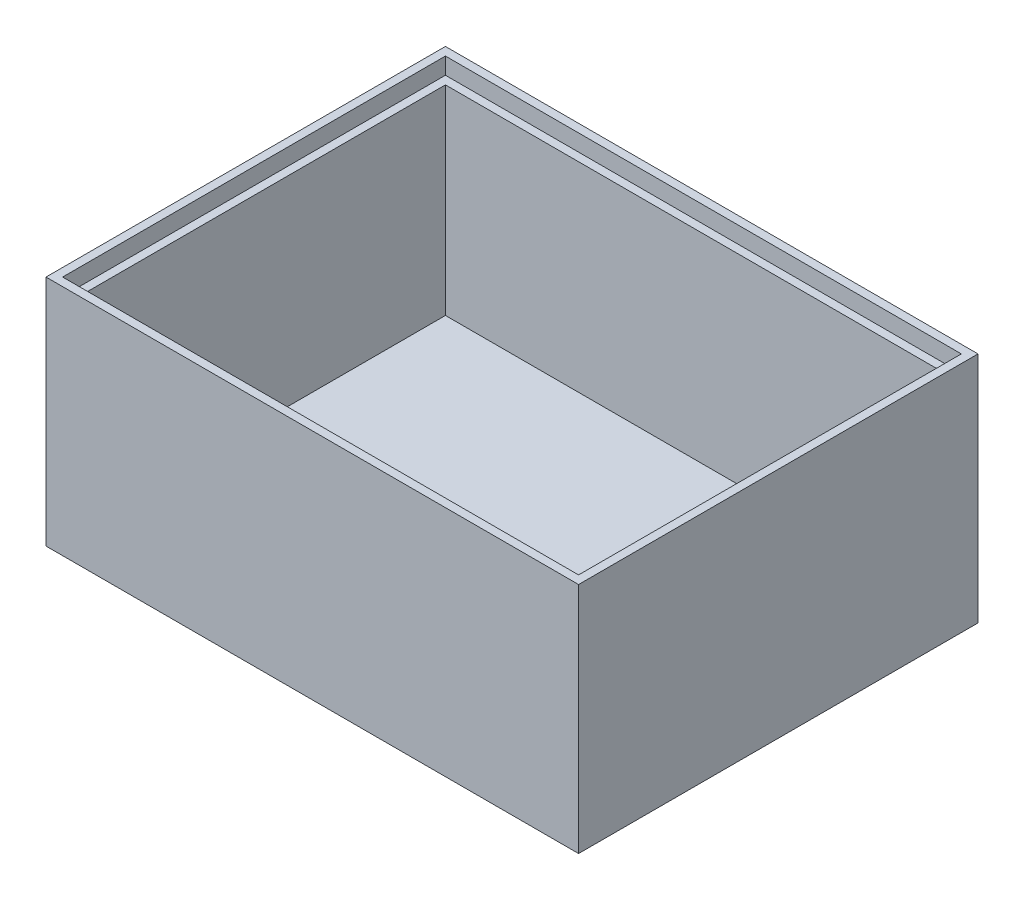
ISO-10303-21;
HEADER;
FILE_DESCRIPTION(('STEP AP214'),'2;1');
FILE_NAME('part.step','',(''),(''),'','','');
FILE_SCHEMA(('AUTOMOTIVE_DESIGN { 1 0 10303 214 1 1 1 1 }'));
ENDSEC;
DATA;
#1=APPLICATION_CONTEXT('core data for automotive mechanical design processes');
#2=APPLICATION_PROTOCOL_DEFINITION('international standard','automotive_design',2000,#1);
#3=PRODUCT_CONTEXT('',#1,'mechanical');
#4=PRODUCT('Part','Part','',(#3));
#5=PRODUCT_RELATED_PRODUCT_CATEGORY('part','',(#4));
#6=PRODUCT_DEFINITION_FORMATION('','',#4);
#7=PRODUCT_DEFINITION_CONTEXT('part definition',#1,'design');
#8=PRODUCT_DEFINITION('design','',#6,#7);
#9=PRODUCT_DEFINITION_SHAPE('','',#8);
#10=(LENGTH_UNIT() NAMED_UNIT(*) SI_UNIT(.MILLI.,.METRE.));
#11=(NAMED_UNIT(*) PLANE_ANGLE_UNIT() SI_UNIT($,.RADIAN.));
#12=(NAMED_UNIT(*) SI_UNIT($,.STERADIAN.) SOLID_ANGLE_UNIT());
#13=UNCERTAINTY_MEASURE_WITH_UNIT(LENGTH_MEASURE(1.E-05),#10,'distance_accuracy_value','');
#14=(GEOMETRIC_REPRESENTATION_CONTEXT(3) GLOBAL_UNCERTAINTY_ASSIGNED_CONTEXT((#13)) GLOBAL_UNIT_ASSIGNED_CONTEXT((#10,
#11,#12)) REPRESENTATION_CONTEXT('',''));
#15=CARTESIAN_POINT('',(0.,0.,0.));
#16=DIRECTION('',(0.,0.,1.));
#17=DIRECTION('',(1.,0.,0.));
#18=AXIS2_PLACEMENT_3D('',#15,#16,#17);
#19=CARTESIAN_POINT('',(0.,82.55,0.));
#20=DIRECTION('',(0.,-1.,0.));
#21=DIRECTION('',(0.,0.,-1.));
#22=AXIS2_PLACEMENT_3D('',#19,#20,#21);
#23=PLANE('',#22);
#24=DIRECTION('',(1.,0.,0.));
#25=VECTOR('',#24,1.);
#26=CARTESIAN_POINT('',(-98.425,82.55,73.025));
#27=LINE('',#26,#25);
#28=CARTESIAN_POINT('',(-98.425,82.55,73.025));
#29=VERTEX_POINT('',#28);
#30=CARTESIAN_POINT('',(98.425,82.55,73.025));
#31=VERTEX_POINT('',#30);
#32=EDGE_CURVE('E141',#29,#31,#27,.T.);
#33=ORIENTED_EDGE('',*,*,#32,.T.);
#34=DIRECTION('',(0.,0.,-1.));
#35=VECTOR('',#34,1.);
#36=CARTESIAN_POINT('',(98.425,82.55,73.025));
#37=LINE('',#36,#35);
#38=CARTESIAN_POINT('',(98.425,82.55,-73.025));
#39=VERTEX_POINT('',#38);
#40=EDGE_CURVE('E164',#31,#39,#37,.T.);
#41=ORIENTED_EDGE('',*,*,#40,.T.);
#42=DIRECTION('',(-1.,0.,0.));
#43=VECTOR('',#42,1.);
#44=CARTESIAN_POINT('',(-98.425,82.55,-73.025));
#45=LINE('',#44,#43);
#46=CARTESIAN_POINT('',(-98.425,82.55,-73.025));
#47=VERTEX_POINT('',#46);
#48=EDGE_CURVE('E147',#39,#47,#45,.T.);
#49=ORIENTED_EDGE('',*,*,#48,.T.);
#50=DIRECTION('',(0.,0.,1.));
#51=VECTOR('',#50,1.);
#52=CARTESIAN_POINT('',(-98.425,82.55,73.025));
#53=LINE('',#52,#51);
#54=EDGE_CURVE('E169',#47,#29,#53,.T.);
#55=ORIENTED_EDGE('',*,*,#54,.T.);
#56=EDGE_LOOP('',(#33,#41,#49,#55));
#57=FACE_BOUND('',#56,.T.);
#58=DIRECTION('',(0.,0.,-1.));
#59=VECTOR('',#58,1.);
#60=CARTESIAN_POINT('',(95.25,82.55,69.85));
#61=LINE('',#60,#59);
#62=CARTESIAN_POINT('',(95.25,82.55,69.85));
#63=VERTEX_POINT('',#62);
#64=CARTESIAN_POINT('',(95.25,82.55,-69.85));
#65=VERTEX_POINT('',#64);
#66=EDGE_CURVE('E199',#63,#65,#61,.T.);
#67=ORIENTED_EDGE('',*,*,#66,.F.);
#68=DIRECTION('',(1.,0.,0.));
#69=VECTOR('',#68,1.);
#70=CARTESIAN_POINT('',(-95.25,82.55,69.85));
#71=LINE('',#70,#69);
#72=CARTESIAN_POINT('',(-95.25,82.55,69.85));
#73=VERTEX_POINT('',#72);
#74=EDGE_CURVE('E210',#73,#63,#71,.T.);
#75=ORIENTED_EDGE('',*,*,#74,.F.);
#76=DIRECTION('',(0.,0.,1.));
#77=VECTOR('',#76,1.);
#78=CARTESIAN_POINT('',(-95.25,82.55,69.85));
#79=LINE('',#78,#77);
#80=CARTESIAN_POINT('',(-95.25,82.55,-69.85));
#81=VERTEX_POINT('',#80);
#82=EDGE_CURVE('E206',#81,#73,#79,.T.);
#83=ORIENTED_EDGE('',*,*,#82,.F.);
#84=DIRECTION('',(-1.,0.,0.));
#85=VECTOR('',#84,1.);
#86=CARTESIAN_POINT('',(-95.25,82.55,-69.85));
#87=LINE('',#86,#85);
#88=EDGE_CURVE('E202',#65,#81,#87,.T.);
#89=ORIENTED_EDGE('',*,*,#88,.F.);
#90=EDGE_LOOP('',(#67,#75,#83,#89));
#91=FACE_BOUND('',#90,.T.);
#92=ADVANCED_FACE('F39',(#57,#91),#23,.F.);
#93=CARTESIAN_POINT('',(95.25,82.55,69.85));
#94=DIRECTION('',(-1.,0.,0.));
#95=DIRECTION('',(0.,0.,1.));
#96=AXIS2_PLACEMENT_3D('',#93,#94,#95);
#97=PLANE('',#96);
#98=DIRECTION('',(0.,0.,-1.));
#99=VECTOR('',#98,1.);
#100=CARTESIAN_POINT('',(95.25,6.35,69.85));
#101=LINE('',#100,#99);
#102=CARTESIAN_POINT('',(95.25,6.35,69.85));
#103=VERTEX_POINT('',#102);
#104=CARTESIAN_POINT('',(95.25,6.35,-69.85));
#105=VERTEX_POINT('',#104);
#106=EDGE_CURVE('E198',#103,#105,#101,.T.);
#107=ORIENTED_EDGE('',*,*,#106,.F.);
#108=DIRECTION('',(0.,-1.,0.));
#109=VECTOR('',#108,1.);
#110=CARTESIAN_POINT('',(95.25,82.55,69.85));
#111=LINE('',#110,#109);
#112=EDGE_CURVE('E63',#63,#103,#111,.T.);
#113=ORIENTED_EDGE('',*,*,#112,.F.);
#114=ORIENTED_EDGE('',*,*,#66,.T.);
#115=DIRECTION('',(0.,-1.,0.));
#116=VECTOR('',#115,1.);
#117=CARTESIAN_POINT('',(95.25,82.55,-69.85));
#118=LINE('',#117,#116);
#119=EDGE_CURVE('E235',#65,#105,#118,.T.);
#120=ORIENTED_EDGE('',*,*,#119,.T.);
#121=EDGE_LOOP('',(#107,#113,#114,#120));
#122=FACE_BOUND('',#121,.T.);
#123=ADVANCED_FACE('F285',(#122),#97,.T.);
#124=CARTESIAN_POINT('',(-95.25,82.55,-69.85));
#125=DIRECTION('',(0.,0.,1.));
#126=DIRECTION('',(1.,0.,0.));
#127=AXIS2_PLACEMENT_3D('',#124,#125,#126);
#128=PLANE('',#127);
#129=DIRECTION('',(-1.,0.,0.));
#130=VECTOR('',#129,1.);
#131=CARTESIAN_POINT('',(-95.25,6.35,-69.85));
#132=LINE('',#131,#130);
#133=CARTESIAN_POINT('',(-95.25,6.35,-69.85));
#134=VERTEX_POINT('',#133);
#135=EDGE_CURVE('E216',#105,#134,#132,.T.);
#136=ORIENTED_EDGE('',*,*,#135,.F.);
#137=ORIENTED_EDGE('',*,*,#119,.F.);
#138=ORIENTED_EDGE('',*,*,#88,.T.);
#139=DIRECTION('',(0.,-1.,0.));
#140=VECTOR('',#139,1.);
#141=CARTESIAN_POINT('',(-95.25,82.55,-69.85));
#142=LINE('',#141,#140);
#143=EDGE_CURVE('E232',#81,#134,#142,.T.);
#144=ORIENTED_EDGE('',*,*,#143,.T.);
#145=EDGE_LOOP('',(#136,#137,#138,#144));
#146=FACE_BOUND('',#145,.T.);
#147=ADVANCED_FACE('F291',(#146),#128,.T.);
#148=CARTESIAN_POINT('',(-95.25,82.55,69.85));
#149=DIRECTION('',(1.,0.,0.));
#150=DIRECTION('',(0.,0.,-1.));
#151=AXIS2_PLACEMENT_3D('',#148,#149,#150);
#152=PLANE('',#151);
#153=DIRECTION('',(0.,0.,1.));
#154=VECTOR('',#153,1.);
#155=CARTESIAN_POINT('',(-95.25,6.35,69.85));
#156=LINE('',#155,#154);
#157=CARTESIAN_POINT('',(-95.25,6.35,69.85));
#158=VERTEX_POINT('',#157);
#159=EDGE_CURVE('E220',#134,#158,#156,.T.);
#160=ORIENTED_EDGE('',*,*,#159,.F.);
#161=ORIENTED_EDGE('',*,*,#143,.F.);
#162=ORIENTED_EDGE('',*,*,#82,.T.);
#163=DIRECTION('',(0.,-1.,0.));
#164=VECTOR('',#163,1.);
#165=CARTESIAN_POINT('',(-95.25,82.55,69.85));
#166=LINE('',#165,#164);
#167=EDGE_CURVE('E229',#73,#158,#166,.T.);
#168=ORIENTED_EDGE('',*,*,#167,.T.);
#169=EDGE_LOOP('',(#160,#161,#162,#168));
#170=FACE_BOUND('',#169,.T.);
#171=ADVANCED_FACE('F378',(#170),#152,.T.);
#172=CARTESIAN_POINT('',(-95.25,82.55,69.85));
#173=DIRECTION('',(0.,0.,-1.));
#174=DIRECTION('',(-1.,0.,0.));
#175=AXIS2_PLACEMENT_3D('',#172,#173,#174);
#176=PLANE('',#175);
#177=DIRECTION('',(1.,0.,0.));
#178=VECTOR('',#177,1.);
#179=CARTESIAN_POINT('',(-95.25,6.35,69.85));
#180=LINE('',#179,#178);
#181=EDGE_CURVE('E203',#158,#103,#180,.T.);
#182=ORIENTED_EDGE('',*,*,#181,.F.);
#183=ORIENTED_EDGE('',*,*,#167,.F.);
#184=ORIENTED_EDGE('',*,*,#74,.T.);
#185=ORIENTED_EDGE('',*,*,#112,.T.);
#186=EDGE_LOOP('',(#182,#183,#184,#185));
#187=FACE_BOUND('',#186,.T.);
#188=ADVANCED_FACE('F300',(#187),#176,.T.);
#189=CARTESIAN_POINT('',(0.,6.35,0.));
#190=DIRECTION('',(0.,-1.,0.));
#191=DIRECTION('',(0.,0.,-1.));
#192=AXIS2_PLACEMENT_3D('',#189,#190,#191);
#193=PLANE('',#192);
#194=ORIENTED_EDGE('',*,*,#181,.T.);
#195=ORIENTED_EDGE('',*,*,#106,.T.);
#196=ORIENTED_EDGE('',*,*,#135,.T.);
#197=ORIENTED_EDGE('',*,*,#159,.T.);
#198=EDGE_LOOP('',(#194,#195,#196,#197));
#199=FACE_BOUND('',#198,.T.);
#200=ADVANCED_FACE('F297',(#199),#193,.F.);
#201=CARTESIAN_POINT('',(0.,88.9,0.));
#202=DIRECTION('',(0.,-1.,0.));
#203=DIRECTION('',(0.,0.,-1.));
#204=AXIS2_PLACEMENT_3D('',#201,#202,#203);
#205=PLANE('',#204);
#206=DIRECTION('',(0.,0.,-1.));
#207=VECTOR('',#206,1.);
#208=CARTESIAN_POINT('',(101.6,88.9,76.2));
#209=LINE('',#208,#207);
#210=CARTESIAN_POINT('',(101.6,88.9,76.2));
#211=VERTEX_POINT('',#210);
#212=CARTESIAN_POINT('',(101.6,88.9,-76.2));
#213=VERTEX_POINT('',#212);
#214=EDGE_CURVE('E149',#211,#213,#209,.T.);
#215=ORIENTED_EDGE('',*,*,#214,.T.);
#216=DIRECTION('',(-1.,0.,0.));
#217=VECTOR('',#216,1.);
#218=CARTESIAN_POINT('',(-101.6,88.9,-76.2));
#219=LINE('',#218,#217);
#220=CARTESIAN_POINT('',(-101.6,88.9,-76.2));
#221=VERTEX_POINT('',#220);
#222=EDGE_CURVE('E186',#213,#221,#219,.T.);
#223=ORIENTED_EDGE('',*,*,#222,.T.);
#224=DIRECTION('',(0.,0.,1.));
#225=VECTOR('',#224,1.);
#226=CARTESIAN_POINT('',(-101.6,88.9,76.2));
#227=LINE('',#226,#225);
#228=CARTESIAN_POINT('',(-101.6,88.9,76.2));
#229=VERTEX_POINT('',#228);
#230=EDGE_CURVE('E190',#221,#229,#227,.T.);
#231=ORIENTED_EDGE('',*,*,#230,.T.);
#232=DIRECTION('',(1.,0.,0.));
#233=VECTOR('',#232,1.);
#234=CARTESIAN_POINT('',(-101.6,88.9,76.2));
#235=LINE('',#234,#233);
#236=EDGE_CURVE('E194',#229,#211,#235,.T.);
#237=ORIENTED_EDGE('',*,*,#236,.T.);
#238=EDGE_LOOP('',(#215,#223,#231,#237));
#239=FACE_BOUND('',#238,.T.);
#240=DIRECTION('',(0.,0.,-1.));
#241=VECTOR('',#240,1.);
#242=CARTESIAN_POINT('',(98.425,88.9,73.025));
#243=LINE('',#242,#241);
#244=CARTESIAN_POINT('',(98.425,88.9,73.025));
#245=VERTEX_POINT('',#244);
#246=CARTESIAN_POINT('',(98.425,88.9,-73.025));
#247=VERTEX_POINT('',#246);
#248=EDGE_CURVE('E131',#245,#247,#243,.T.);
#249=ORIENTED_EDGE('',*,*,#248,.F.);
#250=DIRECTION('',(1.,0.,0.));
#251=VECTOR('',#250,1.);
#252=CARTESIAN_POINT('',(-98.425,88.9,73.025));
#253=LINE('',#252,#251);
#254=CARTESIAN_POINT('',(-98.425,88.9,73.025));
#255=VERTEX_POINT('',#254);
#256=EDGE_CURVE('E159',#255,#245,#253,.T.);
#257=ORIENTED_EDGE('',*,*,#256,.F.);
#258=DIRECTION('',(0.,0.,1.));
#259=VECTOR('',#258,1.);
#260=CARTESIAN_POINT('',(-98.425,88.9,73.025));
#261=LINE('',#260,#259);
#262=CARTESIAN_POINT('',(-98.425,88.9,-73.025));
#263=VERTEX_POINT('',#262);
#264=EDGE_CURVE('E155',#263,#255,#261,.T.);
#265=ORIENTED_EDGE('',*,*,#264,.F.);
#266=DIRECTION('',(-1.,0.,0.));
#267=VECTOR('',#266,1.);
#268=CARTESIAN_POINT('',(-98.425,88.9,-73.025));
#269=LINE('',#268,#267);
#270=EDGE_CURVE('E140',#247,#263,#269,.T.);
#271=ORIENTED_EDGE('',*,*,#270,.F.);
#272=EDGE_LOOP('',(#249,#257,#265,#271));
#273=FACE_BOUND('',#272,.T.);
#274=ADVANCED_FACE('F153',(#239,#273),#205,.F.);
#275=CARTESIAN_POINT('',(98.425,88.9,73.025));
#276=DIRECTION('',(-1.,0.,0.));
#277=DIRECTION('',(0.,0.,1.));
#278=AXIS2_PLACEMENT_3D('',#275,#276,#277);
#279=PLANE('',#278);
#280=ORIENTED_EDGE('',*,*,#40,.F.);
#281=DIRECTION('',(0.,-1.,0.));
#282=VECTOR('',#281,1.);
#283=CARTESIAN_POINT('',(98.425,88.9,73.025));
#284=LINE('',#283,#282);
#285=EDGE_CURVE('E55',#245,#31,#284,.T.);
#286=ORIENTED_EDGE('',*,*,#285,.F.);
#287=ORIENTED_EDGE('',*,*,#248,.T.);
#288=DIRECTION('',(0.,-1.,0.));
#289=VECTOR('',#288,1.);
#290=CARTESIAN_POINT('',(98.425,88.9,-73.025));
#291=LINE('',#290,#289);
#292=EDGE_CURVE('E134',#247,#39,#291,.T.);
#293=ORIENTED_EDGE('',*,*,#292,.T.);
#294=EDGE_LOOP('',(#280,#286,#287,#293));
#295=FACE_BOUND('',#294,.T.);
#296=ADVANCED_FACE('F133',(#295),#279,.T.);
#297=CARTESIAN_POINT('',(-98.425,88.9,-73.025));
#298=DIRECTION('',(0.,0.,1.));
#299=DIRECTION('',(1.,0.,0.));
#300=AXIS2_PLACEMENT_3D('',#297,#298,#299);
#301=PLANE('',#300);
#302=ORIENTED_EDGE('',*,*,#48,.F.);
#303=ORIENTED_EDGE('',*,*,#292,.F.);
#304=ORIENTED_EDGE('',*,*,#270,.T.);
#305=DIRECTION('',(0.,-1.,0.));
#306=VECTOR('',#305,1.);
#307=CARTESIAN_POINT('',(-98.425,88.9,-73.025));
#308=LINE('',#307,#306);
#309=EDGE_CURVE('E150',#263,#47,#308,.T.);
#310=ORIENTED_EDGE('',*,*,#309,.T.);
#311=EDGE_LOOP('',(#302,#303,#304,#310));
#312=FACE_BOUND('',#311,.T.);
#313=ADVANCED_FACE('F144',(#312),#301,.T.);
#314=CARTESIAN_POINT('',(-98.425,88.9,73.025));
#315=DIRECTION('',(1.,0.,0.));
#316=DIRECTION('',(0.,0.,-1.));
#317=AXIS2_PLACEMENT_3D('',#314,#315,#316);
#318=PLANE('',#317);
#319=ORIENTED_EDGE('',*,*,#54,.F.);
#320=ORIENTED_EDGE('',*,*,#309,.F.);
#321=ORIENTED_EDGE('',*,*,#264,.T.);
#322=DIRECTION('',(0.,-1.,0.));
#323=VECTOR('',#322,1.);
#324=CARTESIAN_POINT('',(-98.425,88.9,73.025));
#325=LINE('',#324,#323);
#326=EDGE_CURVE('E178',#255,#29,#325,.T.);
#327=ORIENTED_EDGE('',*,*,#326,.T.);
#328=EDGE_LOOP('',(#319,#320,#321,#327));
#329=FACE_BOUND('',#328,.T.);
#330=ADVANCED_FACE('F414',(#329),#318,.T.);
#331=CARTESIAN_POINT('',(-98.425,88.9,73.025));
#332=DIRECTION('',(0.,0.,-1.));
#333=DIRECTION('',(-1.,0.,0.));
#334=AXIS2_PLACEMENT_3D('',#331,#332,#333);
#335=PLANE('',#334);
#336=ORIENTED_EDGE('',*,*,#32,.F.);
#337=ORIENTED_EDGE('',*,*,#326,.F.);
#338=ORIENTED_EDGE('',*,*,#256,.T.);
#339=ORIENTED_EDGE('',*,*,#285,.T.);
#340=EDGE_LOOP('',(#336,#337,#338,#339));
#341=FACE_BOUND('',#340,.T.);
#342=ADVANCED_FACE('F304',(#341),#335,.T.);
#343=CARTESIAN_POINT('',(0.,0.,0.));
#344=DIRECTION('',(0.,-1.,0.));
#345=DIRECTION('',(0.,0.,-1.));
#346=AXIS2_PLACEMENT_3D('',#343,#344,#345);
#347=PLANE('',#346);
#348=DIRECTION('',(0.,0.,-1.));
#349=VECTOR('',#348,1.);
#350=CARTESIAN_POINT('',(101.6,0.,76.2));
#351=LINE('',#350,#349);
#352=CARTESIAN_POINT('',(101.6,0.,76.2));
#353=VERTEX_POINT('',#352);
#354=CARTESIAN_POINT('',(101.6,0.,-76.2));
#355=VERTEX_POINT('',#354);
#356=EDGE_CURVE('E239',#353,#355,#351,.T.);
#357=ORIENTED_EDGE('',*,*,#356,.F.);
#358=DIRECTION('',(1.,0.,0.));
#359=VECTOR('',#358,1.);
#360=CARTESIAN_POINT('',(-101.6,0.,76.2));
#361=LINE('',#360,#359);
#362=CARTESIAN_POINT('',(-101.6,0.,76.2));
#363=VERTEX_POINT('',#362);
#364=EDGE_CURVE('E249',#363,#353,#361,.T.);
#365=ORIENTED_EDGE('',*,*,#364,.F.);
#366=DIRECTION('',(0.,0.,1.));
#367=VECTOR('',#366,1.);
#368=CARTESIAN_POINT('',(-101.6,0.,76.2));
#369=LINE('',#368,#367);
#370=CARTESIAN_POINT('',(-101.6,0.,-76.2));
#371=VERTEX_POINT('',#370);
#372=EDGE_CURVE('E246',#371,#363,#369,.T.);
#373=ORIENTED_EDGE('',*,*,#372,.F.);
#374=DIRECTION('',(-1.,0.,0.));
#375=VECTOR('',#374,1.);
#376=CARTESIAN_POINT('',(-101.6,0.,-76.2));
#377=LINE('',#376,#375);
#378=EDGE_CURVE('E243',#355,#371,#377,.T.);
#379=ORIENTED_EDGE('',*,*,#378,.F.);
#380=EDGE_LOOP('',(#357,#365,#373,#379));
#381=FACE_BOUND('',#380,.T.);
#382=ADVANCED_FACE('F270',(#381),#347,.T.);
#383=CARTESIAN_POINT('',(-101.6,6.35,76.2));
#384=DIRECTION('',(0.,0.,-1.));
#385=DIRECTION('',(-1.,0.,0.));
#386=AXIS2_PLACEMENT_3D('',#383,#384,#385);
#387=PLANE('',#386);
#388=ORIENTED_EDGE('',*,*,#364,.T.);
#389=DIRECTION('',(0.,-1.,0.));
#390=VECTOR('',#389,1.);
#391=CARTESIAN_POINT('',(101.6,6.35,76.2));
#392=LINE('',#391,#390);
#393=EDGE_CURVE('E252',#211,#353,#392,.T.);
#394=ORIENTED_EDGE('',*,*,#393,.F.);
#395=ORIENTED_EDGE('',*,*,#236,.F.);
#396=DIRECTION('',(0.,-1.,0.));
#397=VECTOR('',#396,1.);
#398=CARTESIAN_POINT('',(-101.6,6.35,76.2));
#399=LINE('',#398,#397);
#400=EDGE_CURVE('E256',#229,#363,#399,.T.);
#401=ORIENTED_EDGE('',*,*,#400,.T.);
#402=EDGE_LOOP('',(#388,#394,#395,#401));
#403=FACE_BOUND('',#402,.T.);
#404=ADVANCED_FACE('F272',(#403),#387,.F.);
#405=CARTESIAN_POINT('',(-101.6,6.35,76.2));
#406=DIRECTION('',(1.,0.,0.));
#407=DIRECTION('',(0.,0.,-1.));
#408=AXIS2_PLACEMENT_3D('',#405,#406,#407);
#409=PLANE('',#408);
#410=ORIENTED_EDGE('',*,*,#372,.T.);
#411=ORIENTED_EDGE('',*,*,#400,.F.);
#412=ORIENTED_EDGE('',*,*,#230,.F.);
#413=DIRECTION('',(0.,-1.,0.));
#414=VECTOR('',#413,1.);
#415=CARTESIAN_POINT('',(-101.6,6.35,-76.2));
#416=LINE('',#415,#414);
#417=EDGE_CURVE('E48',#221,#371,#416,.T.);
#418=ORIENTED_EDGE('',*,*,#417,.T.);
#419=EDGE_LOOP('',(#410,#411,#412,#418));
#420=FACE_BOUND('',#419,.T.);
#421=ADVANCED_FACE('F264',(#420),#409,.F.);
#422=CARTESIAN_POINT('',(-101.6,6.35,-76.2));
#423=DIRECTION('',(0.,0.,1.));
#424=DIRECTION('',(1.,0.,0.));
#425=AXIS2_PLACEMENT_3D('',#422,#423,#424);
#426=PLANE('',#425);
#427=ORIENTED_EDGE('',*,*,#378,.T.);
#428=ORIENTED_EDGE('',*,*,#417,.F.);
#429=ORIENTED_EDGE('',*,*,#222,.F.);
#430=DIRECTION('',(0.,-1.,0.));
#431=VECTOR('',#430,1.);
#432=CARTESIAN_POINT('',(101.6,6.35,-76.2));
#433=LINE('',#432,#431);
#434=EDGE_CURVE('E11',#213,#355,#433,.T.);
#435=ORIENTED_EDGE('',*,*,#434,.T.);
#436=EDGE_LOOP('',(#427,#428,#429,#435));
#437=FACE_BOUND('',#436,.T.);
#438=ADVANCED_FACE('F277',(#437),#426,.F.);
#439=CARTESIAN_POINT('',(101.6,6.35,76.2));
#440=DIRECTION('',(-1.,0.,0.));
#441=DIRECTION('',(0.,0.,1.));
#442=AXIS2_PLACEMENT_3D('',#439,#440,#441);
#443=PLANE('',#442);
#444=ORIENTED_EDGE('',*,*,#356,.T.);
#445=ORIENTED_EDGE('',*,*,#434,.F.);
#446=ORIENTED_EDGE('',*,*,#214,.F.);
#447=ORIENTED_EDGE('',*,*,#393,.T.);
#448=EDGE_LOOP('',(#444,#445,#446,#447));
#449=FACE_BOUND('',#448,.T.);
#450=ADVANCED_FACE('F41',(#449),#443,.F.);
#451=CLOSED_SHELL('',(#92,#123,#147,#171,#188,#200,#274,#296,#313,#330,#342,#382,#404,#421,#438,#450));
#452=MANIFOLD_SOLID_BREP('B2',#451);
#453=ADVANCED_BREP_SHAPE_REPRESENTATION('',(#18,#452),#14);
#454=SHAPE_DEFINITION_REPRESENTATION(#9,#453);
ENDSEC;
END-ISO-10303-21;
